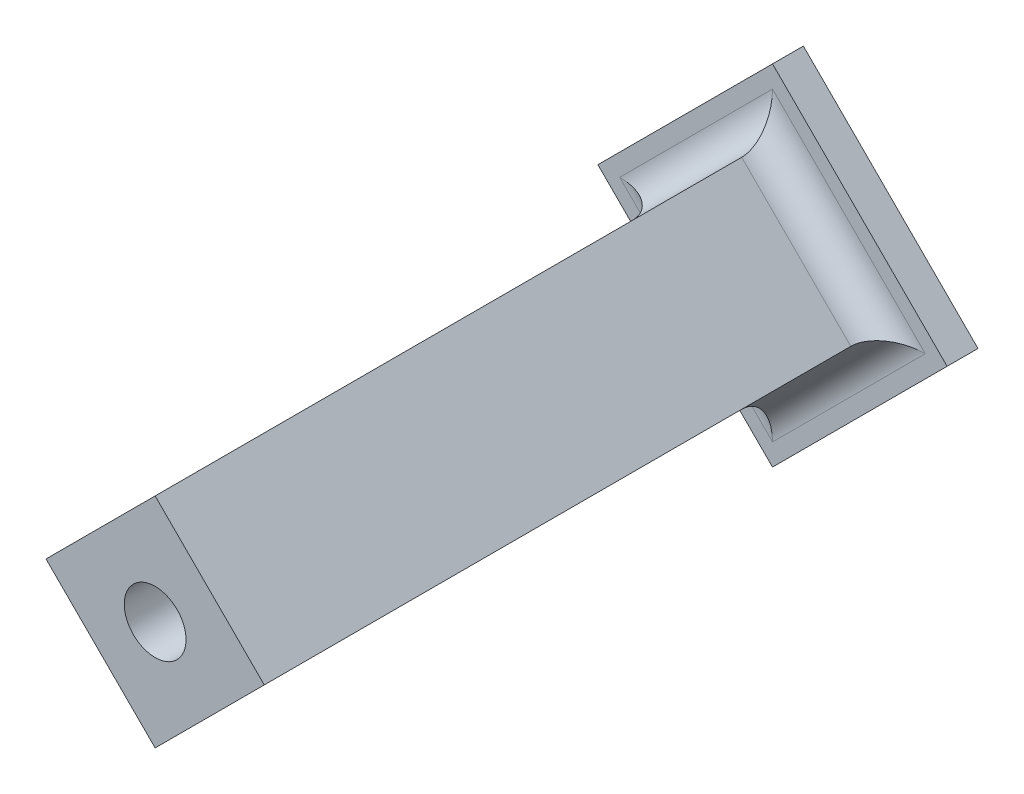
ISO-10303-21;
HEADER;
FILE_DESCRIPTION(('STEP AP214'),'2;1');
FILE_NAME('part.step','',(''),(''),'','','');
FILE_SCHEMA(('AUTOMOTIVE_DESIGN { 1 0 10303 214 1 1 1 1 }'));
ENDSEC;
DATA;
#1=APPLICATION_CONTEXT('core data for automotive mechanical design processes');
#2=APPLICATION_PROTOCOL_DEFINITION('international standard','automotive_design',2000,#1);
#3=PRODUCT_CONTEXT('',#1,'mechanical');
#4=PRODUCT('Part','Part','',(#3));
#5=PRODUCT_RELATED_PRODUCT_CATEGORY('part','',(#4));
#6=PRODUCT_DEFINITION_FORMATION('','',#4);
#7=PRODUCT_DEFINITION_CONTEXT('part definition',#1,'design');
#8=PRODUCT_DEFINITION('design','',#6,#7);
#9=PRODUCT_DEFINITION_SHAPE('','',#8);
#10=(LENGTH_UNIT() NAMED_UNIT(*) SI_UNIT(.MILLI.,.METRE.));
#11=(NAMED_UNIT(*) PLANE_ANGLE_UNIT() SI_UNIT($,.RADIAN.));
#12=(NAMED_UNIT(*) SI_UNIT($,.STERADIAN.) SOLID_ANGLE_UNIT());
#13=UNCERTAINTY_MEASURE_WITH_UNIT(LENGTH_MEASURE(1.E-05),#10,'distance_accuracy_value','');
#14=(GEOMETRIC_REPRESENTATION_CONTEXT(3) GLOBAL_UNCERTAINTY_ASSIGNED_CONTEXT((#13)) GLOBAL_UNIT_ASSIGNED_CONTEXT((#10,
#11,#12)) REPRESENTATION_CONTEXT('',''));
#15=CARTESIAN_POINT('',(0.,0.,0.));
#16=DIRECTION('',(0.,0.,1.));
#17=DIRECTION('',(1.,0.,0.));
#18=AXIS2_PLACEMENT_3D('',#15,#16,#17);
#19=CARTESIAN_POINT('',(0.,0.,0.));
#20=DIRECTION('',(0.,0.,1.));
#21=DIRECTION('',(1.,0.,0.));
#22=AXIS2_PLACEMENT_3D('',#19,#20,#21);
#23=CYLINDRICAL_SURFACE('',#22,1.);
#24=CARTESIAN_POINT('',(0.,0.,21.));
#25=DIRECTION('',(0.,0.,1.));
#26=DIRECTION('',(1.,0.,0.));
#27=AXIS2_PLACEMENT_3D('',#24,#25,#26);
#28=CIRCLE('',#27,1.);
#29=CARTESIAN_POINT('',(1.,0.,21.));
#30=VERTEX_POINT('',#29);
#31=EDGE_CURVE('E127',#30,#30,#28,.T.);
#32=CARTESIAN_POINT('',(0.,0.,1.));
#33=DIRECTION('',(0.,0.,-1.));
#34=DIRECTION('',(-1.,0.,0.));
#35=AXIS2_PLACEMENT_3D('',#32,#33,#34);
#36=CIRCLE('',#35,1.);
#37=CARTESIAN_POINT('',(1.,0.,1.));
#38=VERTEX_POINT('',#37);
#39=EDGE_CURVE('E37',#38,#38,#36,.F.);
#40=CARTESIAN_POINT('',(1.,0.,21.));
#41=CARTESIAN_POINT('',(1.,0.,20.7916666666667));
#42=CARTESIAN_POINT('',(1.,0.,20.5833333333333));
#43=CARTESIAN_POINT('',(1.,0.,20.1666666666667));
#44=CARTESIAN_POINT('',(1.,0.,19.9583333333333));
#45=CARTESIAN_POINT('',(1.,0.,19.5416666666667));
#46=CARTESIAN_POINT('',(1.,0.,19.3333333333333));
#47=CARTESIAN_POINT('',(1.,0.,18.9166666666667));
#48=CARTESIAN_POINT('',(1.,0.,18.7083333333333));
#49=CARTESIAN_POINT('',(1.,0.,18.2916666666667));
#50=CARTESIAN_POINT('',(1.,0.,18.0833333333333));
#51=CARTESIAN_POINT('',(1.,0.,17.6666666666667));
#52=CARTESIAN_POINT('',(1.,0.,17.4583333333333));
#53=CARTESIAN_POINT('',(1.,0.,17.0416666666667));
#54=CARTESIAN_POINT('',(1.,0.,16.8333333333333));
#55=CARTESIAN_POINT('',(1.,0.,16.4166666666667));
#56=CARTESIAN_POINT('',(1.,0.,16.2083333333333));
#57=CARTESIAN_POINT('',(1.,0.,15.7916666666667));
#58=CARTESIAN_POINT('',(1.,0.,15.5833333333333));
#59=CARTESIAN_POINT('',(1.,0.,15.1666666666667));
#60=CARTESIAN_POINT('',(1.,0.,14.9583333333333));
#61=CARTESIAN_POINT('',(1.,0.,14.5416666666667));
#62=CARTESIAN_POINT('',(1.,0.,14.3333333333333));
#63=CARTESIAN_POINT('',(1.,0.,13.9166666666667));
#64=CARTESIAN_POINT('',(1.,0.,13.7083333333333));
#65=CARTESIAN_POINT('',(1.,0.,13.2916666666667));
#66=CARTESIAN_POINT('',(1.,0.,13.0833333333333));
#67=CARTESIAN_POINT('',(1.,0.,12.6666666666667));
#68=CARTESIAN_POINT('',(1.,0.,12.4583333333333));
#69=CARTESIAN_POINT('',(1.,0.,12.0416666666667));
#70=CARTESIAN_POINT('',(1.,0.,11.8333333333333));
#71=CARTESIAN_POINT('',(1.,0.,11.4166666666667));
#72=CARTESIAN_POINT('',(1.,0.,11.2083333333333));
#73=CARTESIAN_POINT('',(1.,0.,10.7916666666667));
#74=CARTESIAN_POINT('',(1.,0.,10.5833333333333));
#75=CARTESIAN_POINT('',(1.,0.,10.1666666666667));
#76=CARTESIAN_POINT('',(1.,0.,9.95833333333333));
#77=CARTESIAN_POINT('',(1.,0.,9.54166666666667));
#78=CARTESIAN_POINT('',(1.,0.,9.33333333333333));
#79=CARTESIAN_POINT('',(1.,0.,8.91666666666667));
#80=CARTESIAN_POINT('',(1.,0.,8.70833333333333));
#81=CARTESIAN_POINT('',(1.,0.,8.29166666666667));
#82=CARTESIAN_POINT('',(1.,0.,8.08333333333333));
#83=CARTESIAN_POINT('',(1.,0.,7.66666666666667));
#84=CARTESIAN_POINT('',(1.,0.,7.45833333333333));
#85=CARTESIAN_POINT('',(1.,0.,7.04166666666667));
#86=CARTESIAN_POINT('',(1.,0.,6.83333333333334));
#87=CARTESIAN_POINT('',(1.,0.,6.41666666666667));
#88=CARTESIAN_POINT('',(1.,0.,6.20833333333333));
#89=CARTESIAN_POINT('',(1.,0.,5.79166666666667));
#90=CARTESIAN_POINT('',(1.,0.,5.58333333333333));
#91=CARTESIAN_POINT('',(1.,0.,5.16666666666667));
#92=CARTESIAN_POINT('',(1.,0.,4.95833333333333));
#93=CARTESIAN_POINT('',(1.,0.,4.54166666666667));
#94=CARTESIAN_POINT('',(1.,0.,4.33333333333333));
#95=CARTESIAN_POINT('',(1.,0.,3.91666666666667));
#96=CARTESIAN_POINT('',(1.,0.,3.70833333333333));
#97=CARTESIAN_POINT('',(1.,0.,3.29166666666667));
#98=CARTESIAN_POINT('',(1.,0.,3.08333333333334));
#99=CARTESIAN_POINT('',(1.,0.,2.66666666666667));
#100=CARTESIAN_POINT('',(1.,0.,2.45833333333333));
#101=CARTESIAN_POINT('',(1.,0.,2.04166666666667));
#102=CARTESIAN_POINT('',(1.,0.,1.83333333333333));
#103=CARTESIAN_POINT('',(1.,0.,1.41666666666667));
#104=CARTESIAN_POINT('',(1.,0.,1.20833333333333));
#105=CARTESIAN_POINT('',(1.,0.,1.));
#106=B_SPLINE_CURVE_WITH_KNOTS('',3,(#40,#41,#42,#43,#44,#45,#46,#47,#48,#49,#50,#51,#52,#53,
#54,#55,#56,#57,#58,#59,#60,#61,#62,#63,#64,#65,#66,#67,#68,#69,#70,#71,#72,#73,#74,#75,#76,#77,
#78,#79,#80,#81,#82,#83,#84,#85,#86,#87,#88,#89,#90,#91,#92,#93,#94,#95,#96,#97,#98,#99,#100,
#101,#102,#103,#104,#105),.UNSPECIFIED.,.F.,.F.,(4,2,2,2,2,2,2,2,2,2,2,2,2,2,2,2,2,2,2,2,2,2,2,
2,2,2,2,2,2,2,2,2,4),(0.,0.625000000000001,1.25,1.875,2.5,3.125,3.75,4.375,5.,5.625,6.25,6.875,
7.5,8.125,8.75,9.375,10.,10.625,11.25,11.875,12.5,13.125,13.75,14.375,15.,15.625,16.25,16.875,
17.5,18.125,18.75,19.375,20.),.UNSPECIFIED.);
#107=EDGE_CURVE('BSEAM33',#30,#38,#106,.T.);
#108=ORIENTED_EDGE('',*,*,#31,.T.);
#109=ORIENTED_EDGE('',*,*,#39,.F.);
#110=ORIENTED_EDGE('',*,*,#107,.T.);
#111=ORIENTED_EDGE('',*,*,#107,.F.);
#112=EDGE_LOOP('',(#108,#110,#109,#111));
#113=FACE_BOUND('',#112,.T.);
#114=ADVANCED_FACE('F33',(#113),#23,.F.);
#115=CARTESIAN_POINT('',(0.,0.,1.));
#116=DIRECTION('',(0.,0.,1.));
#117=DIRECTION('',(1.,0.,0.));
#118=AXIS2_PLACEMENT_3D('',#115,#116,#117);
#119=PLANE('',#118);
#120=DIRECTION('',(-0.707106781186547,-0.707106781186548,0.));
#121=VECTOR('',#120,1.);
#122=CARTESIAN_POINT('',(-2.47487373415292,2.47487373415292,1.));
#123=LINE('',#122,#121);
#124=CARTESIAN_POINT('',(-4.94974746830583,0.,1.));
#125=VERTEX_POINT('',#124);
#126=CARTESIAN_POINT('',(0.,4.94974746830583,1.));
#127=VERTEX_POINT('',#126);
#128=EDGE_CURVE('E168',#125,#127,#123,.F.);
#129=ORIENTED_EDGE('',*,*,#128,.T.);
#130=DIRECTION('',(-0.707106781186548,0.707106781186547,0.));
#131=VECTOR('',#130,1.);
#132=CARTESIAN_POINT('',(2.47487373415292,2.47487373415292,1.));
#133=LINE('',#132,#131);
#134=CARTESIAN_POINT('',(4.94974746830583,0.,1.));
#135=VERTEX_POINT('',#134);
#136=EDGE_CURVE('E174',#127,#135,#133,.F.);
#137=ORIENTED_EDGE('',*,*,#136,.T.);
#138=DIRECTION('',(0.707106781186547,0.707106781186548,0.));
#139=VECTOR('',#138,1.);
#140=CARTESIAN_POINT('',(2.47487373415292,-2.47487373415292,1.));
#141=LINE('',#140,#139);
#142=CARTESIAN_POINT('',(0.,-4.94974746830583,1.));
#143=VERTEX_POINT('',#142);
#144=EDGE_CURVE('E172',#135,#143,#141,.F.);
#145=ORIENTED_EDGE('',*,*,#144,.T.);
#146=DIRECTION('',(0.707106781186548,-0.707106781186547,0.));
#147=VECTOR('',#146,1.);
#148=CARTESIAN_POINT('',(-2.47487373415291,-2.47487373415292,1.));
#149=LINE('',#148,#147);
#150=EDGE_CURVE('E170',#143,#125,#149,.F.);
#151=ORIENTED_EDGE('',*,*,#150,.T.);
#152=EDGE_LOOP('',(#129,#137,#145,#151));
#153=FACE_BOUND('',#152,.T.);
#154=DIRECTION('',(0.707106781186548,-0.707106781186547,0.));
#155=VECTOR('',#154,1.);
#156=CARTESIAN_POINT('',(-5.65685424949238,0.,1.));
#157=LINE('',#156,#155);
#158=CARTESIAN_POINT('',(-5.65685424949238,0.,1.));
#159=VERTEX_POINT('',#158);
#160=CARTESIAN_POINT('',(0.,-5.65685424949238,1.));
#161=VERTEX_POINT('',#160);
#162=EDGE_CURVE('E139',#159,#161,#157,.T.);
#163=ORIENTED_EDGE('',*,*,#162,.T.);
#164=DIRECTION('',(0.707106781186548,0.707106781186548,0.));
#165=VECTOR('',#164,1.);
#166=CARTESIAN_POINT('',(0.,-5.65685424949238,1.));
#167=LINE('',#166,#165);
#168=CARTESIAN_POINT('',(5.65685424949238,0.,1.));
#169=VERTEX_POINT('',#168);
#170=EDGE_CURVE('E142',#161,#169,#167,.T.);
#171=ORIENTED_EDGE('',*,*,#170,.T.);
#172=DIRECTION('',(-0.707106781186548,0.707106781186548,0.));
#173=VECTOR('',#172,1.);
#174=CARTESIAN_POINT('',(0.,5.65685424949238,1.));
#175=LINE('',#174,#173);
#176=CARTESIAN_POINT('',(0.,5.65685424949238,1.));
#177=VERTEX_POINT('',#176);
#178=EDGE_CURVE('E145',#169,#177,#175,.T.);
#179=ORIENTED_EDGE('',*,*,#178,.T.);
#180=DIRECTION('',(-0.707106781186548,-0.707106781186547,0.));
#181=VECTOR('',#180,1.);
#182=CARTESIAN_POINT('',(-5.65685424949238,0.,1.));
#183=LINE('',#182,#181);
#184=EDGE_CURVE('E147',#177,#159,#183,.T.);
#185=ORIENTED_EDGE('',*,*,#184,.T.);
#186=EDGE_LOOP('',(#163,#171,#179,#185));
#187=FACE_BOUND('',#186,.T.);
#188=ADVANCED_FACE('F220',(#153,#187),#119,.T.);
#189=CARTESIAN_POINT('',(-5.65685424949238,0.,1.));
#190=DIRECTION('',(0.707106781186547,0.707106781186548,0.));
#191=DIRECTION('',(-0.707106781186548,0.707106781186547,0.));
#192=AXIS2_PLACEMENT_3D('',#189,#190,#191);
#193=PLANE('',#192);
#194=DIRECTION('',(0.707106781186548,-0.707106781186547,0.));
#195=VECTOR('',#194,1.);
#196=CARTESIAN_POINT('',(-5.65685424949238,0.,0.));
#197=LINE('',#196,#195);
#198=CARTESIAN_POINT('',(-5.65685424949238,0.,0.));
#199=VERTEX_POINT('',#198);
#200=CARTESIAN_POINT('',(0.,-5.65685424949238,0.));
#201=VERTEX_POINT('',#200);
#202=EDGE_CURVE('E130',#199,#201,#197,.T.);
#203=ORIENTED_EDGE('',*,*,#202,.T.);
#204=DIRECTION('',(0.,0.,-1.));
#205=VECTOR('',#204,1.);
#206=CARTESIAN_POINT('',(0.,-5.65685424949238,1.));
#207=LINE('',#206,#205);
#208=EDGE_CURVE('E162',#161,#201,#207,.T.);
#209=ORIENTED_EDGE('',*,*,#208,.F.);
#210=ORIENTED_EDGE('',*,*,#162,.F.);
#211=DIRECTION('',(0.,0.,-1.));
#212=VECTOR('',#211,1.);
#213=CARTESIAN_POINT('',(-5.65685424949238,0.,1.));
#214=LINE('',#213,#212);
#215=EDGE_CURVE('E148',#159,#199,#214,.T.);
#216=ORIENTED_EDGE('',*,*,#215,.T.);
#217=EDGE_LOOP('',(#203,#209,#210,#216));
#218=FACE_BOUND('',#217,.T.);
#219=ADVANCED_FACE('F223',(#218),#193,.F.);
#220=CARTESIAN_POINT('',(0.,-5.65685424949238,1.));
#221=DIRECTION('',(-0.707106781186547,0.707106781186547,0.));
#222=DIRECTION('',(-0.707106781186548,-0.707106781186548,0.));
#223=AXIS2_PLACEMENT_3D('',#220,#221,#222);
#224=PLANE('',#223);
#225=DIRECTION('',(0.707106781186548,0.707106781186548,0.));
#226=VECTOR('',#225,1.);
#227=CARTESIAN_POINT('',(0.,-5.65685424949238,0.));
#228=LINE('',#227,#226);
#229=CARTESIAN_POINT('',(5.65685424949238,0.,0.));
#230=VERTEX_POINT('',#229);
#231=EDGE_CURVE('E133',#201,#230,#228,.T.);
#232=ORIENTED_EDGE('',*,*,#231,.T.);
#233=DIRECTION('',(0.,0.,-1.));
#234=VECTOR('',#233,1.);
#235=CARTESIAN_POINT('',(5.65685424949238,0.,1.));
#236=LINE('',#235,#234);
#237=EDGE_CURVE('E159',#169,#230,#236,.T.);
#238=ORIENTED_EDGE('',*,*,#237,.F.);
#239=ORIENTED_EDGE('',*,*,#170,.F.);
#240=ORIENTED_EDGE('',*,*,#208,.T.);
#241=EDGE_LOOP('',(#232,#238,#239,#240));
#242=FACE_BOUND('',#241,.T.);
#243=ADVANCED_FACE('F233',(#242),#224,.F.);
#244=CARTESIAN_POINT('',(0.,5.65685424949238,1.));
#245=DIRECTION('',(-0.707106781186548,-0.707106781186547,0.));
#246=DIRECTION('',(0.707106781186547,-0.707106781186548,0.));
#247=AXIS2_PLACEMENT_3D('',#244,#245,#246);
#248=PLANE('',#247);
#249=DIRECTION('',(-0.707106781186548,0.707106781186548,0.));
#250=VECTOR('',#249,1.);
#251=CARTESIAN_POINT('',(0.,5.65685424949238,0.));
#252=LINE('',#251,#250);
#253=CARTESIAN_POINT('',(0.,5.65685424949238,0.));
#254=VERTEX_POINT('',#253);
#255=EDGE_CURVE('E151',#230,#254,#252,.T.);
#256=ORIENTED_EDGE('',*,*,#255,.T.);
#257=DIRECTION('',(0.,0.,-1.));
#258=VECTOR('',#257,1.);
#259=CARTESIAN_POINT('',(0.,5.65685424949238,1.));
#260=LINE('',#259,#258);
#261=EDGE_CURVE('E156',#177,#254,#260,.T.);
#262=ORIENTED_EDGE('',*,*,#261,.F.);
#263=ORIENTED_EDGE('',*,*,#178,.F.);
#264=ORIENTED_EDGE('',*,*,#237,.T.);
#265=EDGE_LOOP('',(#256,#262,#263,#264));
#266=FACE_BOUND('',#265,.T.);
#267=ADVANCED_FACE('F238',(#266),#248,.F.);
#268=CARTESIAN_POINT('',(-5.65685424949238,0.,1.));
#269=DIRECTION('',(0.707106781186547,-0.707106781186548,0.));
#270=DIRECTION('',(0.707106781186548,0.707106781186547,0.));
#271=AXIS2_PLACEMENT_3D('',#268,#269,#270);
#272=PLANE('',#271);
#273=DIRECTION('',(-0.707106781186548,-0.707106781186547,0.));
#274=VECTOR('',#273,1.);
#275=CARTESIAN_POINT('',(-5.65685424949238,0.,0.));
#276=LINE('',#275,#274);
#277=EDGE_CURVE('E143',#254,#199,#276,.T.);
#278=ORIENTED_EDGE('',*,*,#277,.T.);
#279=ORIENTED_EDGE('',*,*,#215,.F.);
#280=ORIENTED_EDGE('',*,*,#184,.F.);
#281=ORIENTED_EDGE('',*,*,#261,.T.);
#282=EDGE_LOOP('',(#278,#279,#280,#281));
#283=FACE_BOUND('',#282,.T.);
#284=ADVANCED_FACE('F241',(#283),#272,.F.);
#285=CARTESIAN_POINT('',(0.,0.,0.));
#286=DIRECTION('',(0.,0.,1.));
#287=DIRECTION('',(1.,0.,0.));
#288=AXIS2_PLACEMENT_3D('',#285,#286,#287);
#289=PLANE('',#288);
#290=CARTESIAN_POINT('',(0.,0.,0.));
#291=DIRECTION('',(0.,0.,-1.));
#292=DIRECTION('',(-1.,0.,0.));
#293=AXIS2_PLACEMENT_3D('',#290,#291,#292);
#294=CIRCLE('',#293,3.);
#295=CARTESIAN_POINT('',(-3.,0.,0.));
#296=VERTEX_POINT('',#295);
#297=EDGE_CURVE('E196',#296,#296,#294,.T.);
#298=ORIENTED_EDGE('',*,*,#297,.F.);
#299=EDGE_LOOP('',(#298));
#300=FACE_BOUND('',#299,.T.);
#301=ORIENTED_EDGE('',*,*,#202,.F.);
#302=ORIENTED_EDGE('',*,*,#277,.F.);
#303=ORIENTED_EDGE('',*,*,#255,.F.);
#304=ORIENTED_EDGE('',*,*,#231,.F.);
#305=EDGE_LOOP('',(#301,#302,#303,#304));
#306=FACE_BOUND('',#305,.T.);
#307=ADVANCED_FACE('F243',(#300,#306),#289,.F.);
#308=CARTESIAN_POINT('',(0.,-3.53553390593274,21.));
#309=DIRECTION('',(0.707106781186547,0.707106781186548,0.));
#310=DIRECTION('',(-0.707106781186548,0.707106781186547,0.));
#311=AXIS2_PLACEMENT_3D('',#308,#309,#310);
#312=PLANE('',#311);
#313=DIRECTION('',(0.,0.,-1.));
#314=VECTOR('',#313,1.);
#315=CARTESIAN_POINT('',(-3.53553390593274,0.,21.));
#316=LINE('',#315,#314);
#317=CARTESIAN_POINT('',(-3.53553390593274,0.,21.));
#318=VERTEX_POINT('',#317);
#319=CARTESIAN_POINT('',(-3.53553390593274,0.,2.));
#320=VERTEX_POINT('',#319);
#321=EDGE_CURVE('E201',#318,#320,#316,.T.);
#322=ORIENTED_EDGE('',*,*,#321,.T.);
#323=DIRECTION('',(0.707106781186548,-0.707106781186547,0.));
#324=VECTOR('',#323,1.);
#325=CARTESIAN_POINT('',(0.,-3.53553390593274,2.));
#326=LINE('',#325,#324);
#327=CARTESIAN_POINT('',(0.,-3.53553390593274,2.));
#328=VERTEX_POINT('',#327);
#329=EDGE_CURVE('E42',#320,#328,#326,.T.);
#330=ORIENTED_EDGE('',*,*,#329,.T.);
#331=DIRECTION('',(0.,0.,-1.));
#332=VECTOR('',#331,1.);
#333=CARTESIAN_POINT('',(0.,-3.53553390593274,21.));
#334=LINE('',#333,#332);
#335=CARTESIAN_POINT('',(0.,-3.53553390593274,21.));
#336=VERTEX_POINT('',#335);
#337=EDGE_CURVE('E114',#336,#328,#334,.T.);
#338=ORIENTED_EDGE('',*,*,#337,.F.);
#339=DIRECTION('',(0.707106781186548,-0.707106781186547,0.));
#340=VECTOR('',#339,1.);
#341=CARTESIAN_POINT('',(0.,-3.53553390593274,21.));
#342=LINE('',#341,#340);
#343=EDGE_CURVE('E121',#318,#336,#342,.T.);
#344=ORIENTED_EDGE('',*,*,#343,.F.);
#345=EDGE_LOOP('',(#322,#330,#338,#344));
#346=FACE_BOUND('',#345,.T.);
#347=ADVANCED_FACE('F129',(#346),#312,.F.);
#348=CARTESIAN_POINT('',(0.,-3.53553390593274,21.));
#349=DIRECTION('',(-0.707106781186548,0.707106781186547,0.));
#350=DIRECTION('',(-0.707106781186547,-0.707106781186548,0.));
#351=AXIS2_PLACEMENT_3D('',#348,#349,#350);
#352=PLANE('',#351);
#353=ORIENTED_EDGE('',*,*,#337,.T.);
#354=DIRECTION('',(0.707106781186547,0.707106781186548,0.));
#355=VECTOR('',#354,1.);
#356=CARTESIAN_POINT('',(0.,-3.53553390593274,2.));
#357=LINE('',#356,#355);
#358=CARTESIAN_POINT('',(3.53553390593274,0.,2.));
#359=VERTEX_POINT('',#358);
#360=EDGE_CURVE('E177',#328,#359,#357,.T.);
#361=ORIENTED_EDGE('',*,*,#360,.T.);
#362=DIRECTION('',(0.,0.,-1.));
#363=VECTOR('',#362,1.);
#364=CARTESIAN_POINT('',(3.53553390593274,0.,21.));
#365=LINE('',#364,#363);
#366=CARTESIAN_POINT('',(3.53553390593274,0.,21.));
#367=VERTEX_POINT('',#366);
#368=EDGE_CURVE('E117',#367,#359,#365,.T.);
#369=ORIENTED_EDGE('',*,*,#368,.F.);
#370=DIRECTION('',(0.707106781186547,0.707106781186548,0.));
#371=VECTOR('',#370,1.);
#372=CARTESIAN_POINT('',(0.,-3.53553390593274,21.));
#373=LINE('',#372,#371);
#374=EDGE_CURVE('E111',#336,#367,#373,.T.);
#375=ORIENTED_EDGE('',*,*,#374,.F.);
#376=EDGE_LOOP('',(#353,#361,#369,#375));
#377=FACE_BOUND('',#376,.T.);
#378=ADVANCED_FACE('F113',(#377),#352,.F.);
#379=CARTESIAN_POINT('',(3.53553390593274,0.,21.));
#380=DIRECTION('',(-0.707106781186547,-0.707106781186548,0.));
#381=DIRECTION('',(0.707106781186548,-0.707106781186547,0.));
#382=AXIS2_PLACEMENT_3D('',#379,#380,#381);
#383=PLANE('',#382);
#384=ORIENTED_EDGE('',*,*,#368,.T.);
#385=DIRECTION('',(-0.707106781186548,0.707106781186547,0.));
#386=VECTOR('',#385,1.);
#387=CARTESIAN_POINT('',(3.53553390593274,0.,2.));
#388=LINE('',#387,#386);
#389=CARTESIAN_POINT('',(0.,3.53553390593274,2.));
#390=VERTEX_POINT('',#389);
#391=EDGE_CURVE('E165',#359,#390,#388,.T.);
#392=ORIENTED_EDGE('',*,*,#391,.T.);
#393=DIRECTION('',(0.,0.,-1.));
#394=VECTOR('',#393,1.);
#395=CARTESIAN_POINT('',(0.,3.53553390593274,21.));
#396=LINE('',#395,#394);
#397=CARTESIAN_POINT('',(0.,3.53553390593274,21.));
#398=VERTEX_POINT('',#397);
#399=EDGE_CURVE('E135',#398,#390,#396,.T.);
#400=ORIENTED_EDGE('',*,*,#399,.F.);
#401=DIRECTION('',(-0.707106781186548,0.707106781186547,0.));
#402=VECTOR('',#401,1.);
#403=CARTESIAN_POINT('',(3.53553390593274,0.,21.));
#404=LINE('',#403,#402);
#405=EDGE_CURVE('E120',#367,#398,#404,.T.);
#406=ORIENTED_EDGE('',*,*,#405,.F.);
#407=EDGE_LOOP('',(#384,#392,#400,#406));
#408=FACE_BOUND('',#407,.T.);
#409=ADVANCED_FACE('F205',(#408),#383,.F.);
#410=CARTESIAN_POINT('',(-3.53553390593274,0.,21.));
#411=DIRECTION('',(0.707106781186548,-0.707106781186547,0.));
#412=DIRECTION('',(0.707106781186547,0.707106781186548,0.));
#413=AXIS2_PLACEMENT_3D('',#410,#411,#412);
#414=PLANE('',#413);
#415=ORIENTED_EDGE('',*,*,#399,.T.);
#416=DIRECTION('',(-0.707106781186547,-0.707106781186548,0.));
#417=VECTOR('',#416,1.);
#418=CARTESIAN_POINT('',(-3.53553390593274,0.,2.));
#419=LINE('',#418,#417);
#420=EDGE_CURVE('E11',#390,#320,#419,.T.);
#421=ORIENTED_EDGE('',*,*,#420,.T.);
#422=ORIENTED_EDGE('',*,*,#321,.F.);
#423=DIRECTION('',(-0.707106781186547,-0.707106781186548,0.));
#424=VECTOR('',#423,1.);
#425=CARTESIAN_POINT('',(-3.53553390593274,0.,21.));
#426=LINE('',#425,#424);
#427=EDGE_CURVE('E126',#398,#318,#426,.T.);
#428=ORIENTED_EDGE('',*,*,#427,.F.);
#429=EDGE_LOOP('',(#415,#421,#422,#428));
#430=FACE_BOUND('',#429,.T.);
#431=ADVANCED_FACE('F203',(#430),#414,.F.);
#432=CARTESIAN_POINT('',(0.,0.,21.));
#433=DIRECTION('',(0.,0.,-1.));
#434=DIRECTION('',(-1.,0.,0.));
#435=AXIS2_PLACEMENT_3D('',#432,#433,#434);
#436=PLANE('',#435);
#437=ORIENTED_EDGE('',*,*,#31,.F.);
#438=EDGE_LOOP('',(#437));
#439=FACE_BOUND('',#438,.T.);
#440=ORIENTED_EDGE('',*,*,#343,.T.);
#441=ORIENTED_EDGE('',*,*,#374,.T.);
#442=ORIENTED_EDGE('',*,*,#405,.T.);
#443=ORIENTED_EDGE('',*,*,#427,.T.);
#444=EDGE_LOOP('',(#440,#441,#442,#443));
#445=FACE_BOUND('',#444,.T.);
#446=ADVANCED_FACE('F124',(#439,#445),#436,.F.);
#447=CARTESIAN_POINT('',(-0.707106781186545,-4.24264068711928,2.));
#448=DIRECTION('',(0.707106781186548,-0.707106781186547,0.));
#449=DIRECTION('',(0.707106781186547,0.707106781186548,0.));
#450=AXIS2_PLACEMENT_3D('',#447,#448,#449);
#451=CYLINDRICAL_SURFACE('',#450,1.);
#452=CARTESIAN_POINT('',(-4.94974746830583,0.,2.));
#453=DIRECTION('',(0.,-1.,0.));
#454=DIRECTION('',(-1.,0.,0.));
#455=AXIS2_PLACEMENT_3D('',#452,#453,#454);
#456=ELLIPSE('',#455,1.4142135623731,1.);
#457=EDGE_CURVE('E184',#125,#320,#456,.T.);
#458=ORIENTED_EDGE('',*,*,#457,.F.);
#459=ORIENTED_EDGE('',*,*,#150,.F.);
#460=CARTESIAN_POINT('',(0.,-4.94974746830583,2.));
#461=DIRECTION('',(1.,0.,0.));
#462=DIRECTION('',(0.,-1.,0.));
#463=AXIS2_PLACEMENT_3D('',#460,#461,#462);
#464=ELLIPSE('',#463,1.41421356237309,1.);
#465=EDGE_CURVE('E186',#328,#143,#464,.F.);
#466=ORIENTED_EDGE('',*,*,#465,.F.);
#467=ORIENTED_EDGE('',*,*,#329,.F.);
#468=EDGE_LOOP('',(#458,#459,#466,#467));
#469=FACE_BOUND('',#468,.T.);
#470=ADVANCED_FACE('F35',(#469),#451,.F.);
#471=CARTESIAN_POINT('',(0.70710678118655,-4.24264068711928,2.));
#472=DIRECTION('',(0.707106781186547,0.707106781186548,0.));
#473=DIRECTION('',(-0.707106781186548,0.707106781186547,0.));
#474=AXIS2_PLACEMENT_3D('',#471,#472,#473);
#475=CYLINDRICAL_SURFACE('',#474,1.);
#476=ORIENTED_EDGE('',*,*,#465,.T.);
#477=ORIENTED_EDGE('',*,*,#144,.F.);
#478=CARTESIAN_POINT('',(4.94974746830583,0.,2.));
#479=DIRECTION('',(0.,1.,0.));
#480=DIRECTION('',(1.,0.,0.));
#481=AXIS2_PLACEMENT_3D('',#478,#479,#480);
#482=ELLIPSE('',#481,1.4142135623731,1.);
#483=EDGE_CURVE('E182',#359,#135,#482,.F.);
#484=ORIENTED_EDGE('',*,*,#483,.F.);
#485=ORIENTED_EDGE('',*,*,#360,.F.);
#486=EDGE_LOOP('',(#476,#477,#484,#485));
#487=FACE_BOUND('',#486,.T.);
#488=ADVANCED_FACE('F218',(#487),#475,.F.);
#489=CARTESIAN_POINT('',(-4.24264068711928,0.707106781186548,2.));
#490=DIRECTION('',(-0.707106781186547,-0.707106781186548,0.));
#491=DIRECTION('',(0.707106781186548,-0.707106781186547,0.));
#492=AXIS2_PLACEMENT_3D('',#489,#490,#491);
#493=CYLINDRICAL_SURFACE('',#492,1.);
#494=ORIENTED_EDGE('',*,*,#457,.T.);
#495=ORIENTED_EDGE('',*,*,#420,.F.);
#496=CARTESIAN_POINT('',(0.,4.94974746830583,2.));
#497=DIRECTION('',(-1.,0.,0.));
#498=DIRECTION('',(0.,-1.,0.));
#499=AXIS2_PLACEMENT_3D('',#496,#497,#498);
#500=ELLIPSE('',#499,1.41421356237309,1.);
#501=EDGE_CURVE('E180',#127,#390,#500,.T.);
#502=ORIENTED_EDGE('',*,*,#501,.F.);
#503=ORIENTED_EDGE('',*,*,#128,.F.);
#504=EDGE_LOOP('',(#494,#495,#502,#503));
#505=FACE_BOUND('',#504,.T.);
#506=ADVANCED_FACE('F214',(#505),#493,.F.);
#507=CARTESIAN_POINT('',(4.24264068711929,0.707106781186549,2.));
#508=DIRECTION('',(-0.707106781186548,0.707106781186547,0.));
#509=DIRECTION('',(-0.707106781186547,-0.707106781186548,0.));
#510=AXIS2_PLACEMENT_3D('',#507,#508,#509);
#511=CYLINDRICAL_SURFACE('',#510,1.);
#512=ORIENTED_EDGE('',*,*,#483,.T.);
#513=ORIENTED_EDGE('',*,*,#136,.F.);
#514=ORIENTED_EDGE('',*,*,#501,.T.);
#515=ORIENTED_EDGE('',*,*,#391,.F.);
#516=EDGE_LOOP('',(#512,#513,#514,#515));
#517=FACE_BOUND('',#516,.T.);
#518=ADVANCED_FACE('F209',(#517),#511,.F.);
#519=CARTESIAN_POINT('',(0.,0.,1.));
#520=DIRECTION('',(0.,0.,-1.));
#521=DIRECTION('',(-1.,0.,0.));
#522=AXIS2_PLACEMENT_3D('',#519,#520,#521);
#523=PLANE('',#522);
#524=CARTESIAN_POINT('',(0.,0.,1.));
#525=DIRECTION('',(0.,0.,-1.));
#526=DIRECTION('',(-1.,0.,0.));
#527=AXIS2_PLACEMENT_3D('',#524,#525,#526);
#528=CIRCLE('',#527,3.);
#529=CARTESIAN_POINT('',(-3.,0.,1.));
#530=VERTEX_POINT('',#529);
#531=EDGE_CURVE('E395',#530,#530,#528,.T.);
#532=ORIENTED_EDGE('',*,*,#531,.T.);
#533=EDGE_LOOP('',(#532));
#534=FACE_BOUND('',#533,.T.);
#535=ORIENTED_EDGE('',*,*,#39,.T.);
#536=EDGE_LOOP('',(#535));
#537=FACE_BOUND('',#536,.T.);
#538=ADVANCED_FACE('F311',(#534,#537),#523,.T.);
#539=CARTESIAN_POINT('',(0.,0.,1.));
#540=DIRECTION('',(0.,0.,-1.));
#541=DIRECTION('',(-1.,0.,0.));
#542=AXIS2_PLACEMENT_3D('',#539,#540,#541);
#543=CYLINDRICAL_SURFACE('',#542,3.);
#544=ORIENTED_EDGE('',*,*,#531,.F.);
#545=EDGE_LOOP('',(#544));
#546=FACE_BOUND('',#545,.T.);
#547=ORIENTED_EDGE('',*,*,#297,.T.);
#548=EDGE_LOOP('',(#547));
#549=FACE_BOUND('',#548,.T.);
#550=ADVANCED_FACE('F261',(#546,#549),#543,.F.);
#551=CLOSED_SHELL('',(#114,#188,#219,#243,#267,#284,#307,#347,#378,#409,#431,#446,#470,#488,
#506,#518,#538,#550));
#552=MANIFOLD_SOLID_BREP('B2',#551);
#553=ADVANCED_BREP_SHAPE_REPRESENTATION('',(#18,#552),#14);
#554=SHAPE_DEFINITION_REPRESENTATION(#9,#553);
ENDSEC;
END-ISO-10303-21;
